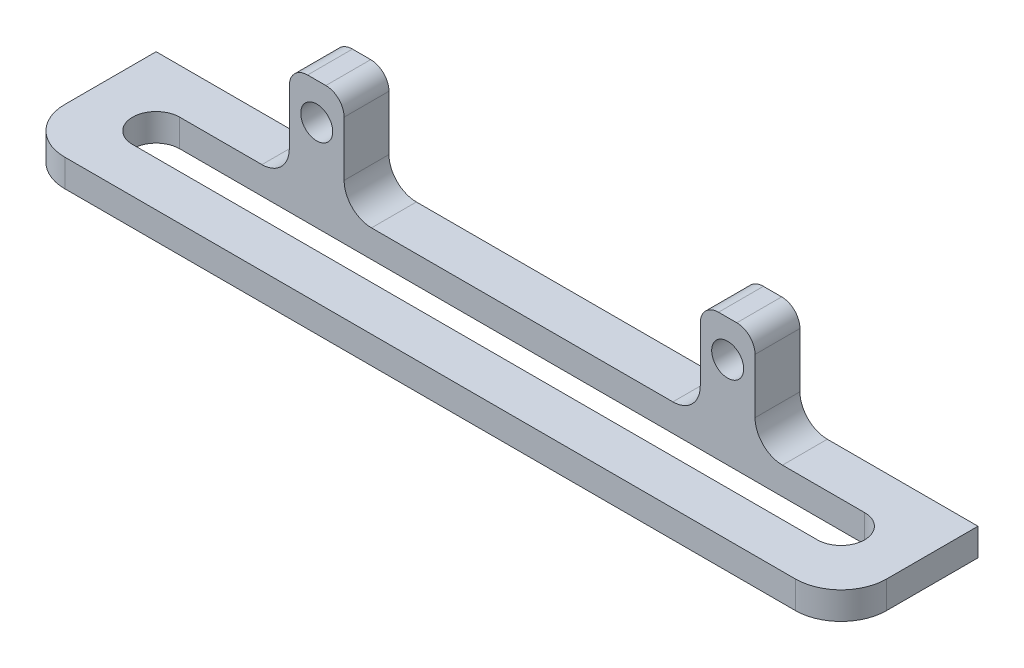
ISO-10303-21;
HEADER;
FILE_DESCRIPTION(('STEP AP214'),'2;1');
FILE_NAME('part.step','',(''),(''),'','','');
FILE_SCHEMA(('AUTOMOTIVE_DESIGN { 1 0 10303 214 1 1 1 1 }'));
ENDSEC;
DATA;
#1=APPLICATION_CONTEXT('core data for automotive mechanical design processes');
#2=APPLICATION_PROTOCOL_DEFINITION('international standard','automotive_design',2000,#1);
#3=PRODUCT_CONTEXT('',#1,'mechanical');
#4=PRODUCT('Part','Part','',(#3));
#5=PRODUCT_RELATED_PRODUCT_CATEGORY('part','',(#4));
#6=PRODUCT_DEFINITION_FORMATION('','',#4);
#7=PRODUCT_DEFINITION_CONTEXT('part definition',#1,'design');
#8=PRODUCT_DEFINITION('design','',#6,#7);
#9=PRODUCT_DEFINITION_SHAPE('','',#8);
#10=(LENGTH_UNIT() NAMED_UNIT(*) SI_UNIT(.MILLI.,.METRE.));
#11=(NAMED_UNIT(*) PLANE_ANGLE_UNIT() SI_UNIT($,.RADIAN.));
#12=(NAMED_UNIT(*) SI_UNIT($,.STERADIAN.) SOLID_ANGLE_UNIT());
#13=UNCERTAINTY_MEASURE_WITH_UNIT(LENGTH_MEASURE(1.E-05),#10,'distance_accuracy_value','');
#14=(GEOMETRIC_REPRESENTATION_CONTEXT(3) GLOBAL_UNCERTAINTY_ASSIGNED_CONTEXT((#13)) GLOBAL_UNIT_ASSIGNED_CONTEXT((#10,
#11,#12)) REPRESENTATION_CONTEXT('',''));
#15=CARTESIAN_POINT('',(0.,0.,0.));
#16=DIRECTION('',(0.,0.,1.));
#17=DIRECTION('',(1.,0.,0.));
#18=AXIS2_PLACEMENT_3D('',#15,#16,#17);
#19=CARTESIAN_POINT('',(0.,3.,0.));
#20=DIRECTION('',(0.,1.,0.));
#21=DIRECTION('',(0.,0.,1.));
#22=AXIS2_PLACEMENT_3D('',#19,#20,#21);
#23=PLANE('',#22);
#24=DIRECTION('',(-1.,0.,0.));
#25=VECTOR('',#24,1.);
#26=CARTESIAN_POINT('',(-37.5,3.,-2.58629015854807));
#27=LINE('',#26,#25);
#28=CARTESIAN_POINT('',(16.5,3.,-2.58629015854807));
#29=VERTEX_POINT('',#28);
#30=CARTESIAN_POINT('',(-16.5,3.,-2.58629015854807));
#31=VERTEX_POINT('',#30);
#32=EDGE_CURVE('E246',#29,#31,#27,.T.);
#33=ORIENTED_EDGE('',*,*,#32,.F.);
#34=DIRECTION('',(0.,0.,1.));
#35=VECTOR('',#34,1.);
#36=CARTESIAN_POINT('',(16.5,3.,0.));
#37=LINE('',#36,#35);
#38=CARTESIAN_POINT('',(16.5,3.,-7.5));
#39=VERTEX_POINT('',#38);
#40=EDGE_CURVE('E353',#29,#39,#37,.F.);
#41=ORIENTED_EDGE('',*,*,#40,.T.);
#42=DIRECTION('',(-1.,0.,0.));
#43=VECTOR('',#42,1.);
#44=CARTESIAN_POINT('',(-45.,3.,-7.5));
#45=LINE('',#44,#43);
#46=CARTESIAN_POINT('',(-16.5,3.,-7.5));
#47=VERTEX_POINT('',#46);
#48=EDGE_CURVE('E267',#39,#47,#45,.T.);
#49=ORIENTED_EDGE('',*,*,#48,.T.);
#50=DIRECTION('',(0.,0.,-1.));
#51=VECTOR('',#50,1.);
#52=CARTESIAN_POINT('',(-16.5,3.,0.));
#53=LINE('',#52,#51);
#54=EDGE_CURVE('E351',#47,#31,#53,.F.);
#55=ORIENTED_EDGE('',*,*,#54,.T.);
#56=EDGE_LOOP('',(#33,#41,#49,#55));
#57=FACE_BOUND('',#56,.T.);
#58=ADVANCED_FACE('F37',(#57),#23,.T.);
#59=CARTESIAN_POINT('',(45.,3.,-7.5));
#60=VERTEX_POINT('',#59);
#61=CARTESIAN_POINT('',(28.5,3.,-7.5));
#62=VERTEX_POINT('',#61);
#63=EDGE_CURVE('E264',#60,#62,#45,.T.);
#64=ORIENTED_EDGE('',*,*,#63,.T.);
#65=DIRECTION('',(0.,0.,-1.));
#66=VECTOR('',#65,1.);
#67=CARTESIAN_POINT('',(28.5,3.,0.));
#68=LINE('',#67,#66);
#69=CARTESIAN_POINT('',(28.5,3.,-2.58629015854807));
#70=VERTEX_POINT('',#69);
#71=EDGE_CURVE('E346',#62,#70,#68,.F.);
#72=ORIENTED_EDGE('',*,*,#71,.T.);
#73=CARTESIAN_POINT('',(37.5,3.,-2.58629015854807));
#74=VERTEX_POINT('',#73);
#75=EDGE_CURVE('E243',#74,#70,#27,.T.);
#76=ORIENTED_EDGE('',*,*,#75,.F.);
#77=CARTESIAN_POINT('',(37.5,3.,0.));
#78=DIRECTION('',(0.,1.,0.));
#79=DIRECTION('',(0.,0.,1.));
#80=AXIS2_PLACEMENT_3D('',#77,#78,#79);
#81=CIRCLE('',#80,2.58629015854807);
#82=CARTESIAN_POINT('',(37.5,3.,2.58629015854807));
#83=VERTEX_POINT('',#82);
#84=EDGE_CURVE('E237',#83,#74,#81,.T.);
#85=ORIENTED_EDGE('',*,*,#84,.F.);
#86=DIRECTION('',(1.,0.,0.));
#87=VECTOR('',#86,1.);
#88=CARTESIAN_POINT('',(-37.5,3.,2.58629015854807));
#89=LINE('',#88,#87);
#90=CARTESIAN_POINT('',(-37.5,3.,2.58629015854807));
#91=VERTEX_POINT('',#90);
#92=EDGE_CURVE('E221',#91,#83,#89,.T.);
#93=ORIENTED_EDGE('',*,*,#92,.F.);
#94=CARTESIAN_POINT('',(-37.5,3.,0.));
#95=DIRECTION('',(0.,1.,0.));
#96=DIRECTION('',(0.,0.,1.));
#97=AXIS2_PLACEMENT_3D('',#94,#95,#96);
#98=CIRCLE('',#97,2.58629015854807);
#99=CARTESIAN_POINT('',(-37.5,3.,-2.58629015854807));
#100=VERTEX_POINT('',#99);
#101=EDGE_CURVE('E211',#100,#91,#98,.T.);
#102=ORIENTED_EDGE('',*,*,#101,.F.);
#103=CARTESIAN_POINT('',(-28.5,3.,-2.58629015854807));
#104=VERTEX_POINT('',#103);
#105=EDGE_CURVE('E239',#104,#100,#27,.T.);
#106=ORIENTED_EDGE('',*,*,#105,.F.);
#107=DIRECTION('',(0.,0.,1.));
#108=VECTOR('',#107,1.);
#109=CARTESIAN_POINT('',(-28.5,3.,0.));
#110=LINE('',#109,#108);
#111=CARTESIAN_POINT('',(-28.5,3.,-7.5));
#112=VERTEX_POINT('',#111);
#113=EDGE_CURVE('E344',#104,#112,#110,.F.);
#114=ORIENTED_EDGE('',*,*,#113,.T.);
#115=CARTESIAN_POINT('',(-45.,3.,-7.5));
#116=VERTEX_POINT('',#115);
#117=EDGE_CURVE('E262',#112,#116,#45,.T.);
#118=ORIENTED_EDGE('',*,*,#117,.T.);
#119=DIRECTION('',(0.,0.,1.));
#120=VECTOR('',#119,1.);
#121=CARTESIAN_POINT('',(-45.,3.,-7.5));
#122=LINE('',#121,#120);
#123=CARTESIAN_POINT('',(-45.,3.,2.5));
#124=VERTEX_POINT('',#123);
#125=EDGE_CURVE('E266',#116,#124,#122,.T.);
#126=ORIENTED_EDGE('',*,*,#125,.T.);
#127=CARTESIAN_POINT('',(-40.,3.,2.5));
#128=DIRECTION('',(0.,1.,0.));
#129=DIRECTION('',(0.,0.,1.));
#130=AXIS2_PLACEMENT_3D('',#127,#128,#129);
#131=CIRCLE('',#130,5.);
#132=CARTESIAN_POINT('',(-40.,3.,7.5));
#133=VERTEX_POINT('',#132);
#134=EDGE_CURVE('E299',#124,#133,#131,.T.);
#135=ORIENTED_EDGE('',*,*,#134,.T.);
#136=DIRECTION('',(1.,0.,0.));
#137=VECTOR('',#136,1.);
#138=CARTESIAN_POINT('',(-45.,3.,7.5));
#139=LINE('',#138,#137);
#140=CARTESIAN_POINT('',(40.,3.,7.5));
#141=VERTEX_POINT('',#140);
#142=EDGE_CURVE('E270',#133,#141,#139,.T.);
#143=ORIENTED_EDGE('',*,*,#142,.T.);
#144=CARTESIAN_POINT('',(40.,3.,2.5));
#145=DIRECTION('',(0.,1.,0.));
#146=DIRECTION('',(0.,0.,1.));
#147=AXIS2_PLACEMENT_3D('',#144,#145,#146);
#148=CIRCLE('',#147,5.);
#149=CARTESIAN_POINT('',(45.,3.,2.5));
#150=VERTEX_POINT('',#149);
#151=EDGE_CURVE('E301',#141,#150,#148,.T.);
#152=ORIENTED_EDGE('',*,*,#151,.T.);
#153=DIRECTION('',(0.,0.,-1.));
#154=VECTOR('',#153,1.);
#155=CARTESIAN_POINT('',(45.,3.,-7.5));
#156=LINE('',#155,#154);
#157=EDGE_CURVE('E260',#150,#60,#156,.T.);
#158=ORIENTED_EDGE('',*,*,#157,.T.);
#159=EDGE_LOOP('',(#64,#72,#76,#85,#93,#102,#106,#114,#118,#126,#135,#143,#152,#158));
#160=FACE_BOUND('',#159,.T.);
#161=ADVANCED_FACE('F234',(#160),#23,.T.);
#162=CARTESIAN_POINT('',(0.,0.,0.));
#163=DIRECTION('',(0.,1.,0.));
#164=DIRECTION('',(0.,0.,1.));
#165=AXIS2_PLACEMENT_3D('',#162,#163,#164);
#166=PLANE('',#165);
#167=DIRECTION('',(0.,0.,-1.));
#168=VECTOR('',#167,1.);
#169=CARTESIAN_POINT('',(45.,0.,-7.5));
#170=LINE('',#169,#168);
#171=CARTESIAN_POINT('',(45.,0.,2.5));
#172=VERTEX_POINT('',#171);
#173=CARTESIAN_POINT('',(45.,0.,-7.5));
#174=VERTEX_POINT('',#173);
#175=EDGE_CURVE('E229',#172,#174,#170,.T.);
#176=ORIENTED_EDGE('',*,*,#175,.F.);
#177=CARTESIAN_POINT('',(40.,0.,2.5));
#178=DIRECTION('',(0.,1.,0.));
#179=DIRECTION('',(0.,0.,1.));
#180=AXIS2_PLACEMENT_3D('',#177,#178,#179);
#181=CIRCLE('',#180,5.);
#182=CARTESIAN_POINT('',(40.,0.,7.5));
#183=VERTEX_POINT('',#182);
#184=EDGE_CURVE('E292',#172,#183,#181,.F.);
#185=ORIENTED_EDGE('',*,*,#184,.T.);
#186=DIRECTION('',(1.,0.,0.));
#187=VECTOR('',#186,1.);
#188=CARTESIAN_POINT('',(-45.,0.,7.5));
#189=LINE('',#188,#187);
#190=CARTESIAN_POINT('',(-40.,0.,7.5));
#191=VERTEX_POINT('',#190);
#192=EDGE_CURVE('E263',#191,#183,#189,.T.);
#193=ORIENTED_EDGE('',*,*,#192,.F.);
#194=CARTESIAN_POINT('',(-40.,0.,2.5));
#195=DIRECTION('',(0.,1.,0.));
#196=DIRECTION('',(0.,0.,1.));
#197=AXIS2_PLACEMENT_3D('',#194,#195,#196);
#198=CIRCLE('',#197,5.);
#199=CARTESIAN_POINT('',(-45.,0.,2.5));
#200=VERTEX_POINT('',#199);
#201=EDGE_CURVE('E290',#191,#200,#198,.F.);
#202=ORIENTED_EDGE('',*,*,#201,.T.);
#203=DIRECTION('',(0.,0.,1.));
#204=VECTOR('',#203,1.);
#205=CARTESIAN_POINT('',(-45.,0.,-7.5));
#206=LINE('',#205,#204);
#207=CARTESIAN_POINT('',(-45.,0.,-7.5));
#208=VERTEX_POINT('',#207);
#209=EDGE_CURVE('E277',#208,#200,#206,.T.);
#210=ORIENTED_EDGE('',*,*,#209,.F.);
#211=DIRECTION('',(-1.,0.,0.));
#212=VECTOR('',#211,1.);
#213=CARTESIAN_POINT('',(-45.,0.,-7.5));
#214=LINE('',#213,#212);
#215=EDGE_CURVE('E275',#174,#208,#214,.T.);
#216=ORIENTED_EDGE('',*,*,#215,.F.);
#217=EDGE_LOOP('',(#176,#185,#193,#202,#210,#216));
#218=FACE_BOUND('',#217,.T.);
#219=CARTESIAN_POINT('',(-37.5,0.,0.));
#220=DIRECTION('',(0.,1.,0.));
#221=DIRECTION('',(0.,0.,1.));
#222=AXIS2_PLACEMENT_3D('',#219,#220,#221);
#223=CIRCLE('',#222,2.58629015854807);
#224=CARTESIAN_POINT('',(-37.5,0.,-2.58629015854807));
#225=VERTEX_POINT('',#224);
#226=CARTESIAN_POINT('',(-37.5,0.,2.58629015854807));
#227=VERTEX_POINT('',#226);
#228=EDGE_CURVE('E247',#225,#227,#223,.T.);
#229=ORIENTED_EDGE('',*,*,#228,.T.);
#230=DIRECTION('',(1.,0.,0.));
#231=VECTOR('',#230,1.);
#232=CARTESIAN_POINT('',(-37.5,0.,2.58629015854807));
#233=LINE('',#232,#231);
#234=CARTESIAN_POINT('',(37.5,0.,2.58629015854807));
#235=VERTEX_POINT('',#234);
#236=EDGE_CURVE('E228',#227,#235,#233,.T.);
#237=ORIENTED_EDGE('',*,*,#236,.T.);
#238=CARTESIAN_POINT('',(37.5,0.,0.));
#239=DIRECTION('',(0.,1.,0.));
#240=DIRECTION('',(0.,0.,1.));
#241=AXIS2_PLACEMENT_3D('',#238,#239,#240);
#242=CIRCLE('',#241,2.58629015854807);
#243=CARTESIAN_POINT('',(37.5,0.,-2.58629015854807));
#244=VERTEX_POINT('',#243);
#245=EDGE_CURVE('E251',#235,#244,#242,.T.);
#246=ORIENTED_EDGE('',*,*,#245,.T.);
#247=DIRECTION('',(-1.,0.,0.));
#248=VECTOR('',#247,1.);
#249=CARTESIAN_POINT('',(-37.5,0.,-2.58629015854807));
#250=LINE('',#249,#248);
#251=EDGE_CURVE('E222',#244,#225,#250,.T.);
#252=ORIENTED_EDGE('',*,*,#251,.T.);
#253=EDGE_LOOP('',(#229,#237,#246,#252));
#254=FACE_BOUND('',#253,.T.);
#255=ADVANCED_FACE('F495',(#218,#254),#166,.F.);
#256=CARTESIAN_POINT('',(45.,3.,-7.5));
#257=DIRECTION('',(-1.,0.,0.));
#258=DIRECTION('',(0.,0.,1.));
#259=AXIS2_PLACEMENT_3D('',#256,#257,#258);
#260=PLANE('',#259);
#261=ORIENTED_EDGE('',*,*,#157,.F.);
#262=DIRECTION('',(0.,-1.,0.));
#263=VECTOR('',#262,1.);
#264=CARTESIAN_POINT('',(45.,3.,2.5));
#265=LINE('',#264,#263);
#266=EDGE_CURVE('E287',#150,#172,#265,.T.);
#267=ORIENTED_EDGE('',*,*,#266,.T.);
#268=ORIENTED_EDGE('',*,*,#175,.T.);
#269=DIRECTION('',(0.,-1.,0.));
#270=VECTOR('',#269,1.);
#271=CARTESIAN_POINT('',(45.,3.,-7.5));
#272=LINE('',#271,#270);
#273=EDGE_CURVE('E284',#60,#174,#272,.T.);
#274=ORIENTED_EDGE('',*,*,#273,.F.);
#275=EDGE_LOOP('',(#261,#267,#268,#274));
#276=FACE_BOUND('',#275,.T.);
#277=ADVANCED_FACE('F437',(#276),#260,.F.);
#278=CARTESIAN_POINT('',(-45.,3.,-7.5));
#279=DIRECTION('',(0.,0.,1.));
#280=DIRECTION('',(1.,0.,0.));
#281=AXIS2_PLACEMENT_3D('',#278,#279,#280);
#282=PLANE('',#281);
#283=CARTESIAN_POINT('',(22.5,10.,-7.5));
#284=DIRECTION('',(0.,0.,1.));
#285=DIRECTION('',(1.,0.,0.));
#286=AXIS2_PLACEMENT_3D('',#283,#284,#285);
#287=CIRCLE('',#286,1.75);
#288=CARTESIAN_POINT('',(24.25,10.,-7.5));
#289=VERTEX_POINT('',#288);
#290=EDGE_CURVE('E817',#289,#289,#287,.T.);
#291=ORIENTED_EDGE('',*,*,#290,.T.);
#292=EDGE_LOOP('',(#291));
#293=FACE_BOUND('',#292,.T.);
#294=CARTESIAN_POINT('',(-22.5,10.,-7.5));
#295=DIRECTION('',(0.,0.,1.));
#296=DIRECTION('',(1.,0.,0.));
#297=AXIS2_PLACEMENT_3D('',#294,#295,#296);
#298=CIRCLE('',#297,1.75);
#299=CARTESIAN_POINT('',(-20.75,10.,-7.5));
#300=VERTEX_POINT('',#299);
#301=EDGE_CURVE('E458',#300,#300,#298,.F.);
#302=ORIENTED_EDGE('',*,*,#301,.F.);
#303=EDGE_LOOP('',(#302));
#304=FACE_BOUND('',#303,.T.);
#305=DIRECTION('',(-1.,0.,0.));
#306=VECTOR('',#305,1.);
#307=CARTESIAN_POINT('',(19.5,14.,-7.50000000000001));
#308=LINE('',#307,#306);
#309=CARTESIAN_POINT('',(23.5,14.,-7.50000000000001));
#310=VERTEX_POINT('',#309);
#311=CARTESIAN_POINT('',(21.5,14.,-7.50000000000001));
#312=VERTEX_POINT('',#311);
#313=EDGE_CURVE('E464',#310,#312,#308,.T.);
#314=ORIENTED_EDGE('',*,*,#313,.F.);
#315=CARTESIAN_POINT('',(23.5,12.,-7.5));
#316=DIRECTION('',(0.,0.,1.));
#317=DIRECTION('',(1.,0.,0.));
#318=AXIS2_PLACEMENT_3D('',#315,#316,#317);
#319=CIRCLE('',#318,2.);
#320=CARTESIAN_POINT('',(25.5,12.,-7.50000000000001));
#321=VERTEX_POINT('',#320);
#322=EDGE_CURVE('E317',#310,#321,#319,.F.);
#323=ORIENTED_EDGE('',*,*,#322,.T.);
#324=DIRECTION('',(0.,-1.,0.));
#325=VECTOR('',#324,1.);
#326=CARTESIAN_POINT('',(25.5,14.,-7.50000000000001));
#327=LINE('',#326,#325);
#328=CARTESIAN_POINT('',(25.5,6.,-7.50000000000001));
#329=VERTEX_POINT('',#328);
#330=EDGE_CURVE('E452',#321,#329,#327,.T.);
#331=ORIENTED_EDGE('',*,*,#330,.T.);
#332=CARTESIAN_POINT('',(28.5,6.,-7.5));
#333=DIRECTION('',(0.,0.,1.));
#334=DIRECTION('',(1.,0.,0.));
#335=AXIS2_PLACEMENT_3D('',#332,#333,#334);
#336=CIRCLE('',#335,3.);
#337=EDGE_CURVE('E360',#329,#62,#336,.T.);
#338=ORIENTED_EDGE('',*,*,#337,.T.);
#339=ORIENTED_EDGE('',*,*,#63,.F.);
#340=ORIENTED_EDGE('',*,*,#273,.T.);
#341=ORIENTED_EDGE('',*,*,#215,.T.);
#342=DIRECTION('',(0.,-1.,0.));
#343=VECTOR('',#342,1.);
#344=CARTESIAN_POINT('',(-45.,3.,-7.5));
#345=LINE('',#344,#343);
#346=EDGE_CURVE('E273',#116,#208,#345,.T.);
#347=ORIENTED_EDGE('',*,*,#346,.F.);
#348=ORIENTED_EDGE('',*,*,#117,.F.);
#349=CARTESIAN_POINT('',(-28.5,6.,-7.5));
#350=DIRECTION('',(0.,0.,1.));
#351=DIRECTION('',(1.,0.,0.));
#352=AXIS2_PLACEMENT_3D('',#349,#350,#351);
#353=CIRCLE('',#352,3.);
#354=CARTESIAN_POINT('',(-25.5,6.,-7.5));
#355=VERTEX_POINT('',#354);
#356=EDGE_CURVE('E11',#112,#355,#353,.T.);
#357=ORIENTED_EDGE('',*,*,#356,.T.);
#358=DIRECTION('',(0.,-1.,0.));
#359=VECTOR('',#358,1.);
#360=CARTESIAN_POINT('',(-25.5,14.,-7.5));
#361=LINE('',#360,#359);
#362=CARTESIAN_POINT('',(-25.5,12.,-7.5));
#363=VERTEX_POINT('',#362);
#364=EDGE_CURVE('E379',#363,#355,#361,.T.);
#365=ORIENTED_EDGE('',*,*,#364,.F.);
#366=CARTESIAN_POINT('',(-23.5,12.,-7.5));
#367=DIRECTION('',(0.,0.,1.));
#368=DIRECTION('',(1.,0.,0.));
#369=AXIS2_PLACEMENT_3D('',#366,#367,#368);
#370=CIRCLE('',#369,2.);
#371=CARTESIAN_POINT('',(-23.5,14.,-7.5));
#372=VERTEX_POINT('',#371);
#373=EDGE_CURVE('E311',#363,#372,#370,.F.);
#374=ORIENTED_EDGE('',*,*,#373,.T.);
#375=DIRECTION('',(-1.,0.,0.));
#376=VECTOR('',#375,1.);
#377=CARTESIAN_POINT('',(-25.5,14.,-7.5));
#378=LINE('',#377,#376);
#379=CARTESIAN_POINT('',(-21.5,14.,-7.5));
#380=VERTEX_POINT('',#379);
#381=EDGE_CURVE('E382',#380,#372,#378,.T.);
#382=ORIENTED_EDGE('',*,*,#381,.F.);
#383=CARTESIAN_POINT('',(-21.5,12.,-7.5));
#384=DIRECTION('',(0.,0.,1.));
#385=DIRECTION('',(1.,0.,0.));
#386=AXIS2_PLACEMENT_3D('',#383,#384,#385);
#387=CIRCLE('',#386,2.);
#388=CARTESIAN_POINT('',(-19.5,12.,-7.5));
#389=VERTEX_POINT('',#388);
#390=EDGE_CURVE('E313',#380,#389,#387,.F.);
#391=ORIENTED_EDGE('',*,*,#390,.T.);
#392=DIRECTION('',(0.,-1.,0.));
#393=VECTOR('',#392,1.);
#394=CARTESIAN_POINT('',(-19.5,14.,-7.5));
#395=LINE('',#394,#393);
#396=CARTESIAN_POINT('',(-19.5,6.,-7.5));
#397=VERTEX_POINT('',#396);
#398=EDGE_CURVE('E381',#389,#397,#395,.T.);
#399=ORIENTED_EDGE('',*,*,#398,.T.);
#400=CARTESIAN_POINT('',(-16.5,6.,-7.5));
#401=DIRECTION('',(0.,0.,1.));
#402=DIRECTION('',(1.,0.,0.));
#403=AXIS2_PLACEMENT_3D('',#400,#401,#402);
#404=CIRCLE('',#403,3.);
#405=EDGE_CURVE('E368',#397,#47,#404,.T.);
#406=ORIENTED_EDGE('',*,*,#405,.T.);
#407=ORIENTED_EDGE('',*,*,#48,.F.);
#408=CARTESIAN_POINT('',(16.5,6.,-7.5));
#409=DIRECTION('',(0.,0.,1.));
#410=DIRECTION('',(1.,0.,0.));
#411=AXIS2_PLACEMENT_3D('',#408,#409,#410);
#412=CIRCLE('',#411,3.);
#413=CARTESIAN_POINT('',(19.5,6.,-7.50000000000001));
#414=VERTEX_POINT('',#413);
#415=EDGE_CURVE('E366',#39,#414,#412,.T.);
#416=ORIENTED_EDGE('',*,*,#415,.T.);
#417=DIRECTION('',(0.,-1.,0.));
#418=VECTOR('',#417,1.);
#419=CARTESIAN_POINT('',(19.5,14.,-7.50000000000001));
#420=LINE('',#419,#418);
#421=CARTESIAN_POINT('',(19.5,12.,-7.50000000000001));
#422=VERTEX_POINT('',#421);
#423=EDGE_CURVE('E455',#422,#414,#420,.T.);
#424=ORIENTED_EDGE('',*,*,#423,.F.);
#425=CARTESIAN_POINT('',(21.5,12.,-7.5));
#426=DIRECTION('',(0.,0.,1.));
#427=DIRECTION('',(1.,0.,0.));
#428=AXIS2_PLACEMENT_3D('',#425,#426,#427);
#429=CIRCLE('',#428,2.);
#430=EDGE_CURVE('E315',#422,#312,#429,.F.);
#431=ORIENTED_EDGE('',*,*,#430,.T.);
#432=EDGE_LOOP('',(#314,#323,#331,#338,#339,#340,#341,#347,#348,#357,#365,#374,#382,#391,#399,
#406,#407,#416,#424,#431));
#433=FACE_BOUND('',#432,.T.);
#434=ADVANCED_FACE('F407',(#293,#304,#433),#282,.F.);
#435=CARTESIAN_POINT('',(-45.,3.,-7.5));
#436=DIRECTION('',(1.,0.,0.));
#437=DIRECTION('',(0.,0.,-1.));
#438=AXIS2_PLACEMENT_3D('',#435,#436,#437);
#439=PLANE('',#438);
#440=ORIENTED_EDGE('',*,*,#209,.T.);
#441=DIRECTION('',(0.,-1.,0.));
#442=VECTOR('',#441,1.);
#443=CARTESIAN_POINT('',(-45.,3.,2.5));
#444=LINE('',#443,#442);
#445=EDGE_CURVE('E303',#200,#124,#444,.F.);
#446=ORIENTED_EDGE('',*,*,#445,.T.);
#447=ORIENTED_EDGE('',*,*,#125,.F.);
#448=ORIENTED_EDGE('',*,*,#346,.T.);
#449=EDGE_LOOP('',(#440,#446,#447,#448));
#450=FACE_BOUND('',#449,.T.);
#451=ADVANCED_FACE('F419',(#450),#439,.F.);
#452=CARTESIAN_POINT('',(-45.,3.,7.5));
#453=DIRECTION('',(0.,0.,-1.));
#454=DIRECTION('',(-1.,0.,0.));
#455=AXIS2_PLACEMENT_3D('',#452,#453,#454);
#456=PLANE('',#455);
#457=ORIENTED_EDGE('',*,*,#192,.T.);
#458=DIRECTION('',(0.,-1.,0.));
#459=VECTOR('',#458,1.);
#460=CARTESIAN_POINT('',(40.,3.,7.5));
#461=LINE('',#460,#459);
#462=EDGE_CURVE('E297',#183,#141,#461,.F.);
#463=ORIENTED_EDGE('',*,*,#462,.T.);
#464=ORIENTED_EDGE('',*,*,#142,.F.);
#465=DIRECTION('',(0.,-1.,0.));
#466=VECTOR('',#465,1.);
#467=CARTESIAN_POINT('',(-40.,3.,7.5));
#468=LINE('',#467,#466);
#469=EDGE_CURVE('E294',#133,#191,#468,.T.);
#470=ORIENTED_EDGE('',*,*,#469,.T.);
#471=EDGE_LOOP('',(#457,#463,#464,#470));
#472=FACE_BOUND('',#471,.T.);
#473=ADVANCED_FACE('F427',(#472),#456,.F.);
#474=CARTESIAN_POINT('',(-37.5,3.,0.));
#475=DIRECTION('',(0.,-1.,0.));
#476=DIRECTION('',(0.,0.,-1.));
#477=AXIS2_PLACEMENT_3D('',#474,#475,#476);
#478=CYLINDRICAL_SURFACE('',#477,2.58629015854807);
#479=ORIENTED_EDGE('',*,*,#228,.F.);
#480=DIRECTION('',(0.,-1.,0.));
#481=VECTOR('',#480,1.);
#482=CARTESIAN_POINT('',(-37.5,3.,-2.58629015854807));
#483=LINE('',#482,#481);
#484=EDGE_CURVE('E217',#100,#225,#483,.T.);
#485=ORIENTED_EDGE('',*,*,#484,.F.);
#486=ORIENTED_EDGE('',*,*,#101,.T.);
#487=DIRECTION('',(0.,-1.,0.));
#488=VECTOR('',#487,1.);
#489=CARTESIAN_POINT('',(-37.5,3.,2.58629015854807));
#490=LINE('',#489,#488);
#491=EDGE_CURVE('E214',#91,#227,#490,.T.);
#492=ORIENTED_EDGE('',*,*,#491,.T.);
#493=EDGE_LOOP('',(#479,#485,#486,#492));
#494=FACE_BOUND('',#493,.T.);
#495=ADVANCED_FACE('F213',(#494),#478,.F.);
#496=CARTESIAN_POINT('',(-37.5,3.,2.58629015854807));
#497=DIRECTION('',(0.,0.,-1.));
#498=DIRECTION('',(-1.,0.,0.));
#499=AXIS2_PLACEMENT_3D('',#496,#497,#498);
#500=PLANE('',#499);
#501=ORIENTED_EDGE('',*,*,#236,.F.);
#502=ORIENTED_EDGE('',*,*,#491,.F.);
#503=ORIENTED_EDGE('',*,*,#92,.T.);
#504=DIRECTION('',(0.,-1.,0.));
#505=VECTOR('',#504,1.);
#506=CARTESIAN_POINT('',(37.5,3.,2.58629015854807));
#507=LINE('',#506,#505);
#508=EDGE_CURVE('E230',#83,#235,#507,.T.);
#509=ORIENTED_EDGE('',*,*,#508,.T.);
#510=EDGE_LOOP('',(#501,#502,#503,#509));
#511=FACE_BOUND('',#510,.T.);
#512=ADVANCED_FACE('F225',(#511),#500,.T.);
#513=CARTESIAN_POINT('',(37.5,3.,0.));
#514=DIRECTION('',(0.,-1.,0.));
#515=DIRECTION('',(0.,0.,-1.));
#516=AXIS2_PLACEMENT_3D('',#513,#514,#515);
#517=CYLINDRICAL_SURFACE('',#516,2.58629015854807);
#518=ORIENTED_EDGE('',*,*,#245,.F.);
#519=ORIENTED_EDGE('',*,*,#508,.F.);
#520=ORIENTED_EDGE('',*,*,#84,.T.);
#521=DIRECTION('',(0.,-1.,0.));
#522=VECTOR('',#521,1.);
#523=CARTESIAN_POINT('',(37.5,3.,-2.58629015854807));
#524=LINE('',#523,#522);
#525=EDGE_CURVE('E257',#74,#244,#524,.T.);
#526=ORIENTED_EDGE('',*,*,#525,.T.);
#527=EDGE_LOOP('',(#518,#519,#520,#526));
#528=FACE_BOUND('',#527,.T.);
#529=ADVANCED_FACE('F615',(#528),#517,.F.);
#530=CARTESIAN_POINT('',(-37.5,3.,-2.58629015854807));
#531=DIRECTION('',(0.,0.,1.));
#532=DIRECTION('',(1.,0.,0.));
#533=AXIS2_PLACEMENT_3D('',#530,#531,#532);
#534=PLANE('',#533);
#535=CARTESIAN_POINT('',(22.5,10.,-2.58629015854807));
#536=DIRECTION('',(0.,0.,-1.));
#537=DIRECTION('',(-1.,0.,0.));
#538=AXIS2_PLACEMENT_3D('',#535,#536,#537);
#539=CIRCLE('',#538,1.75);
#540=CARTESIAN_POINT('',(20.75,10.,-2.58629015854807));
#541=VERTEX_POINT('',#540);
#542=EDGE_CURVE('E820',#541,#541,#539,.T.);
#543=ORIENTED_EDGE('',*,*,#542,.T.);
#544=EDGE_LOOP('',(#543));
#545=FACE_BOUND('',#544,.T.);
#546=CARTESIAN_POINT('',(-22.5,10.,-2.58629015854807));
#547=DIRECTION('',(0.,0.,1.));
#548=DIRECTION('',(1.,0.,0.));
#549=AXIS2_PLACEMENT_3D('',#546,#547,#548);
#550=CIRCLE('',#549,1.75);
#551=CARTESIAN_POINT('',(-20.75,10.,-2.58629015854807));
#552=VERTEX_POINT('',#551);
#553=EDGE_CURVE('E815',#552,#552,#550,.T.);
#554=ORIENTED_EDGE('',*,*,#553,.F.);
#555=EDGE_LOOP('',(#554));
#556=FACE_BOUND('',#555,.T.);
#557=DIRECTION('',(0.,-1.,0.));
#558=VECTOR('',#557,1.);
#559=CARTESIAN_POINT('',(25.5,14.,-2.58629015854807));
#560=LINE('',#559,#558);
#561=CARTESIAN_POINT('',(25.5,12.,-2.58629015854807));
#562=VERTEX_POINT('',#561);
#563=CARTESIAN_POINT('',(25.5,6.,-2.58629015854807));
#564=VERTEX_POINT('',#563);
#565=EDGE_CURVE('E446',#562,#564,#560,.T.);
#566=ORIENTED_EDGE('',*,*,#565,.F.);
#567=CARTESIAN_POINT('',(23.5,12.,-2.58629015854807));
#568=DIRECTION('',(0.,0.,1.));
#569=DIRECTION('',(1.,0.,0.));
#570=AXIS2_PLACEMENT_3D('',#567,#568,#569);
#571=CIRCLE('',#570,2.);
#572=CARTESIAN_POINT('',(23.5,14.,-2.58629015854807));
#573=VERTEX_POINT('',#572);
#574=EDGE_CURVE('E327',#562,#573,#571,.T.);
#575=ORIENTED_EDGE('',*,*,#574,.T.);
#576=DIRECTION('',(1.,0.,0.));
#577=VECTOR('',#576,1.);
#578=CARTESIAN_POINT('',(19.5,14.,-2.58629015854807));
#579=LINE('',#578,#577);
#580=CARTESIAN_POINT('',(21.5,14.,-2.58629015854807));
#581=VERTEX_POINT('',#580);
#582=EDGE_CURVE('E467',#581,#573,#579,.T.);
#583=ORIENTED_EDGE('',*,*,#582,.F.);
#584=CARTESIAN_POINT('',(21.5,12.,-2.58629015854807));
#585=DIRECTION('',(0.,0.,1.));
#586=DIRECTION('',(1.,0.,0.));
#587=AXIS2_PLACEMENT_3D('',#584,#585,#586);
#588=CIRCLE('',#587,2.);
#589=CARTESIAN_POINT('',(19.5,12.,-2.58629015854807));
#590=VERTEX_POINT('',#589);
#591=EDGE_CURVE('E325',#581,#590,#588,.T.);
#592=ORIENTED_EDGE('',*,*,#591,.T.);
#593=DIRECTION('',(0.,-1.,0.));
#594=VECTOR('',#593,1.);
#595=CARTESIAN_POINT('',(19.5,14.,-2.58629015854807));
#596=LINE('',#595,#594);
#597=CARTESIAN_POINT('',(19.5,6.,-2.58629015854807));
#598=VERTEX_POINT('',#597);
#599=EDGE_CURVE('E453',#590,#598,#596,.T.);
#600=ORIENTED_EDGE('',*,*,#599,.T.);
#601=CARTESIAN_POINT('',(16.5,6.,-2.58629015854807));
#602=DIRECTION('',(0.,0.,1.));
#603=DIRECTION('',(1.,0.,0.));
#604=AXIS2_PLACEMENT_3D('',#601,#602,#603);
#605=CIRCLE('',#604,3.);
#606=EDGE_CURVE('E364',#598,#29,#605,.F.);
#607=ORIENTED_EDGE('',*,*,#606,.T.);
#608=ORIENTED_EDGE('',*,*,#32,.T.);
#609=CARTESIAN_POINT('',(-16.5,6.,-2.58629015854807));
#610=DIRECTION('',(0.,0.,1.));
#611=DIRECTION('',(1.,0.,0.));
#612=AXIS2_PLACEMENT_3D('',#609,#610,#611);
#613=CIRCLE('',#612,3.);
#614=CARTESIAN_POINT('',(-19.5,6.,-2.58629015854807));
#615=VERTEX_POINT('',#614);
#616=EDGE_CURVE('E370',#31,#615,#613,.F.);
#617=ORIENTED_EDGE('',*,*,#616,.T.);
#618=DIRECTION('',(0.,-1.,0.));
#619=VECTOR('',#618,1.);
#620=CARTESIAN_POINT('',(-19.5,14.,-2.58629015854807));
#621=LINE('',#620,#619);
#622=CARTESIAN_POINT('',(-19.5,12.,-2.58629015854807));
#623=VERTEX_POINT('',#622);
#624=EDGE_CURVE('E385',#623,#615,#621,.T.);
#625=ORIENTED_EDGE('',*,*,#624,.F.);
#626=CARTESIAN_POINT('',(-21.5,12.,-2.58629015854807));
#627=DIRECTION('',(0.,0.,1.));
#628=DIRECTION('',(1.,0.,0.));
#629=AXIS2_PLACEMENT_3D('',#626,#627,#628);
#630=CIRCLE('',#629,2.);
#631=CARTESIAN_POINT('',(-21.5,14.,-2.58629015854807));
#632=VERTEX_POINT('',#631);
#633=EDGE_CURVE('E323',#623,#632,#630,.T.);
#634=ORIENTED_EDGE('',*,*,#633,.T.);
#635=DIRECTION('',(1.,0.,0.));
#636=VECTOR('',#635,1.);
#637=CARTESIAN_POINT('',(-25.5,14.,-2.58629015854807));
#638=LINE('',#637,#636);
#639=CARTESIAN_POINT('',(-23.5,14.,-2.58629015854807));
#640=VERTEX_POINT('',#639);
#641=EDGE_CURVE('E388',#640,#632,#638,.T.);
#642=ORIENTED_EDGE('',*,*,#641,.F.);
#643=CARTESIAN_POINT('',(-23.5,12.,-2.58629015854807));
#644=DIRECTION('',(0.,0.,1.));
#645=DIRECTION('',(1.,0.,0.));
#646=AXIS2_PLACEMENT_3D('',#643,#644,#645);
#647=CIRCLE('',#646,2.);
#648=CARTESIAN_POINT('',(-25.5,12.,-2.58629015854807));
#649=VERTEX_POINT('',#648);
#650=EDGE_CURVE('E321',#640,#649,#647,.T.);
#651=ORIENTED_EDGE('',*,*,#650,.T.);
#652=DIRECTION('',(0.,-1.,0.));
#653=VECTOR('',#652,1.);
#654=CARTESIAN_POINT('',(-25.5,14.,-2.58629015854807));
#655=LINE('',#654,#653);
#656=CARTESIAN_POINT('',(-25.5,6.,-2.58629015854807));
#657=VERTEX_POINT('',#656);
#658=EDGE_CURVE('E249',#649,#657,#655,.T.);
#659=ORIENTED_EDGE('',*,*,#658,.T.);
#660=CARTESIAN_POINT('',(-28.5,6.,-2.58629015854807));
#661=DIRECTION('',(0.,0.,1.));
#662=DIRECTION('',(1.,0.,0.));
#663=AXIS2_PLACEMENT_3D('',#660,#661,#662);
#664=CIRCLE('',#663,3.);
#665=EDGE_CURVE('E45',#657,#104,#664,.F.);
#666=ORIENTED_EDGE('',*,*,#665,.T.);
#667=ORIENTED_EDGE('',*,*,#105,.T.);
#668=ORIENTED_EDGE('',*,*,#484,.T.);
#669=ORIENTED_EDGE('',*,*,#251,.F.);
#670=ORIENTED_EDGE('',*,*,#525,.F.);
#671=ORIENTED_EDGE('',*,*,#75,.T.);
#672=CARTESIAN_POINT('',(28.5,6.,-2.58629015854807));
#673=DIRECTION('',(0.,0.,1.));
#674=DIRECTION('',(1.,0.,0.));
#675=AXIS2_PLACEMENT_3D('',#672,#673,#674);
#676=CIRCLE('',#675,3.);
#677=EDGE_CURVE('E362',#70,#564,#676,.F.);
#678=ORIENTED_EDGE('',*,*,#677,.T.);
#679=EDGE_LOOP('',(#566,#575,#583,#592,#600,#607,#608,#617,#625,#634,#642,#651,#659,#666,#667,
#668,#669,#670,#671,#678));
#680=FACE_BOUND('',#679,.T.);
#681=ADVANCED_FACE('F374',(#545,#556,#680),#534,.T.);
#682=CARTESIAN_POINT('',(40.,3.,2.5));
#683=DIRECTION('',(0.,-1.,0.));
#684=DIRECTION('',(0.,0.,-1.));
#685=AXIS2_PLACEMENT_3D('',#682,#683,#684);
#686=CYLINDRICAL_SURFACE('',#685,5.);
#687=ORIENTED_EDGE('',*,*,#151,.F.);
#688=ORIENTED_EDGE('',*,*,#462,.F.);
#689=ORIENTED_EDGE('',*,*,#184,.F.);
#690=ORIENTED_EDGE('',*,*,#266,.F.);
#691=EDGE_LOOP('',(#687,#688,#689,#690));
#692=FACE_BOUND('',#691,.T.);
#693=ADVANCED_FACE('F431',(#692),#686,.T.);
#694=CARTESIAN_POINT('',(-40.,3.,2.5));
#695=DIRECTION('',(0.,-1.,0.));
#696=DIRECTION('',(0.,0.,-1.));
#697=AXIS2_PLACEMENT_3D('',#694,#695,#696);
#698=CYLINDRICAL_SURFACE('',#697,5.);
#699=ORIENTED_EDGE('',*,*,#134,.F.);
#700=ORIENTED_EDGE('',*,*,#445,.F.);
#701=ORIENTED_EDGE('',*,*,#201,.F.);
#702=ORIENTED_EDGE('',*,*,#469,.F.);
#703=EDGE_LOOP('',(#699,#700,#701,#702));
#704=FACE_BOUND('',#703,.T.);
#705=ADVANCED_FACE('F422',(#704),#698,.T.);
#706=CARTESIAN_POINT('',(-25.5,14.,-7.5));
#707=DIRECTION('',(1.,0.,0.));
#708=DIRECTION('',(0.,0.,-1.));
#709=AXIS2_PLACEMENT_3D('',#706,#707,#708);
#710=PLANE('',#709);
#711=ORIENTED_EDGE('',*,*,#364,.T.);
#712=DIRECTION('',(0.,0.,1.));
#713=VECTOR('',#712,1.);
#714=CARTESIAN_POINT('',(-25.5,6.,-7.5));
#715=LINE('',#714,#713);
#716=EDGE_CURVE('E358',#355,#657,#715,.T.);
#717=ORIENTED_EDGE('',*,*,#716,.T.);
#718=ORIENTED_EDGE('',*,*,#658,.F.);
#719=DIRECTION('',(0.,0.,1.));
#720=VECTOR('',#719,1.);
#721=CARTESIAN_POINT('',(-25.5,12.,-7.5));
#722=LINE('',#721,#720);
#723=EDGE_CURVE('E339',#649,#363,#722,.F.);
#724=ORIENTED_EDGE('',*,*,#723,.T.);
#725=EDGE_LOOP('',(#711,#717,#718,#724));
#726=FACE_BOUND('',#725,.T.);
#727=ADVANCED_FACE('F377',(#726),#710,.F.);
#728=CARTESIAN_POINT('',(-19.5,14.,-7.5));
#729=DIRECTION('',(-1.,0.,0.));
#730=DIRECTION('',(0.,0.,1.));
#731=AXIS2_PLACEMENT_3D('',#728,#729,#730);
#732=PLANE('',#731);
#733=ORIENTED_EDGE('',*,*,#624,.T.);
#734=DIRECTION('',(0.,0.,-1.));
#735=VECTOR('',#734,1.);
#736=CARTESIAN_POINT('',(-19.5,6.,-7.5));
#737=LINE('',#736,#735);
#738=EDGE_CURVE('E355',#615,#397,#737,.T.);
#739=ORIENTED_EDGE('',*,*,#738,.T.);
#740=ORIENTED_EDGE('',*,*,#398,.F.);
#741=DIRECTION('',(0.,0.,-1.));
#742=VECTOR('',#741,1.);
#743=CARTESIAN_POINT('',(-19.5,12.,-2.58629015854807));
#744=LINE('',#743,#742);
#745=EDGE_CURVE('E337',#389,#623,#744,.F.);
#746=ORIENTED_EDGE('',*,*,#745,.T.);
#747=EDGE_LOOP('',(#733,#739,#740,#746));
#748=FACE_BOUND('',#747,.T.);
#749=ADVANCED_FACE('F396',(#748),#732,.F.);
#750=CARTESIAN_POINT('',(0.,14.,0.));
#751=DIRECTION('',(0.,1.,0.));
#752=DIRECTION('',(0.,0.,1.));
#753=AXIS2_PLACEMENT_3D('',#750,#751,#752);
#754=PLANE('',#753);
#755=ORIENTED_EDGE('',*,*,#641,.T.);
#756=DIRECTION('',(0.,0.,-1.));
#757=VECTOR('',#756,1.);
#758=CARTESIAN_POINT('',(-21.5,14.,-7.5));
#759=LINE('',#758,#757);
#760=EDGE_CURVE('E334',#632,#380,#759,.T.);
#761=ORIENTED_EDGE('',*,*,#760,.T.);
#762=ORIENTED_EDGE('',*,*,#381,.T.);
#763=DIRECTION('',(0.,0.,1.));
#764=VECTOR('',#763,1.);
#765=CARTESIAN_POINT('',(-23.5,14.,-2.58629015854807));
#766=LINE('',#765,#764);
#767=EDGE_CURVE('E331',#372,#640,#766,.T.);
#768=ORIENTED_EDGE('',*,*,#767,.T.);
#769=EDGE_LOOP('',(#755,#761,#762,#768));
#770=FACE_BOUND('',#769,.T.);
#771=ADVANCED_FACE('F473',(#770),#754,.T.);
#772=CARTESIAN_POINT('',(19.5,14.,-7.50000000000001));
#773=DIRECTION('',(1.,0.,0.));
#774=DIRECTION('',(0.,0.,-1.));
#775=AXIS2_PLACEMENT_3D('',#772,#773,#774);
#776=PLANE('',#775);
#777=ORIENTED_EDGE('',*,*,#423,.T.);
#778=DIRECTION('',(0.,0.,1.));
#779=VECTOR('',#778,1.);
#780=CARTESIAN_POINT('',(19.5,6.,-7.50000000000001));
#781=LINE('',#780,#779);
#782=EDGE_CURVE('E348',#414,#598,#781,.T.);
#783=ORIENTED_EDGE('',*,*,#782,.T.);
#784=ORIENTED_EDGE('',*,*,#599,.F.);
#785=DIRECTION('',(0.,0.,1.));
#786=VECTOR('',#785,1.);
#787=CARTESIAN_POINT('',(19.5,12.,-7.50000000000001));
#788=LINE('',#787,#786);
#789=EDGE_CURVE('E329',#590,#422,#788,.F.);
#790=ORIENTED_EDGE('',*,*,#789,.T.);
#791=EDGE_LOOP('',(#777,#783,#784,#790));
#792=FACE_BOUND('',#791,.T.);
#793=ADVANCED_FACE('F534',(#792),#776,.F.);
#794=CARTESIAN_POINT('',(25.5,14.,-7.50000000000001));
#795=DIRECTION('',(-1.,0.,0.));
#796=DIRECTION('',(0.,0.,1.));
#797=AXIS2_PLACEMENT_3D('',#794,#795,#796);
#798=PLANE('',#797);
#799=ORIENTED_EDGE('',*,*,#565,.T.);
#800=DIRECTION('',(0.,0.,-1.));
#801=VECTOR('',#800,1.);
#802=CARTESIAN_POINT('',(25.5,6.,-7.50000000000001));
#803=LINE('',#802,#801);
#804=EDGE_CURVE('E341',#564,#329,#803,.T.);
#805=ORIENTED_EDGE('',*,*,#804,.T.);
#806=ORIENTED_EDGE('',*,*,#330,.F.);
#807=DIRECTION('',(0.,0.,-1.));
#808=VECTOR('',#807,1.);
#809=CARTESIAN_POINT('',(25.5,12.,-2.58629015854807));
#810=LINE('',#809,#808);
#811=EDGE_CURVE('E319',#321,#562,#810,.F.);
#812=ORIENTED_EDGE('',*,*,#811,.T.);
#813=EDGE_LOOP('',(#799,#805,#806,#812));
#814=FACE_BOUND('',#813,.T.);
#815=ADVANCED_FACE('F449',(#814),#798,.F.);
#816=CARTESIAN_POINT('',(0.,14.,0.));
#817=DIRECTION('',(0.,1.,0.));
#818=DIRECTION('',(0.,0.,1.));
#819=AXIS2_PLACEMENT_3D('',#816,#817,#818);
#820=PLANE('',#819);
#821=ORIENTED_EDGE('',*,*,#582,.T.);
#822=DIRECTION('',(0.,0.,-1.));
#823=VECTOR('',#822,1.);
#824=CARTESIAN_POINT('',(23.5,14.,-7.50000000000001));
#825=LINE('',#824,#823);
#826=EDGE_CURVE('E308',#573,#310,#825,.T.);
#827=ORIENTED_EDGE('',*,*,#826,.T.);
#828=ORIENTED_EDGE('',*,*,#313,.T.);
#829=DIRECTION('',(0.,0.,1.));
#830=VECTOR('',#829,1.);
#831=CARTESIAN_POINT('',(21.5,14.,-2.58629015854807));
#832=LINE('',#831,#830);
#833=EDGE_CURVE('E305',#312,#581,#832,.T.);
#834=ORIENTED_EDGE('',*,*,#833,.T.);
#835=EDGE_LOOP('',(#821,#827,#828,#834));
#836=FACE_BOUND('',#835,.T.);
#837=ADVANCED_FACE('F529',(#836),#820,.T.);
#838=CARTESIAN_POINT('',(-22.5,10.,-12.4497474683058));
#839=DIRECTION('',(0.,0.,1.));
#840=DIRECTION('',(1.,0.,0.));
#841=AXIS2_PLACEMENT_3D('',#838,#839,#840);
#842=CYLINDRICAL_SURFACE('',#841,1.75);
#843=ORIENTED_EDGE('',*,*,#301,.T.);
#844=EDGE_LOOP('',(#843));
#845=FACE_BOUND('',#844,.T.);
#846=ORIENTED_EDGE('',*,*,#553,.T.);
#847=EDGE_LOOP('',(#846));
#848=FACE_BOUND('',#847,.T.);
#849=ADVANCED_FACE('F668',(#845,#848),#842,.F.);
#850=CARTESIAN_POINT('',(22.5,10.,-12.4497474683058));
#851=DIRECTION('',(0.,0.,1.));
#852=DIRECTION('',(1.,0.,0.));
#853=AXIS2_PLACEMENT_3D('',#850,#851,#852);
#854=CYLINDRICAL_SURFACE('',#853,1.75);
#855=ORIENTED_EDGE('',*,*,#290,.F.);
#856=EDGE_LOOP('',(#855));
#857=FACE_BOUND('',#856,.T.);
#858=ORIENTED_EDGE('',*,*,#542,.F.);
#859=EDGE_LOOP('',(#858));
#860=FACE_BOUND('',#859,.T.);
#861=ADVANCED_FACE('F518',(#857,#860),#854,.F.);
#862=CARTESIAN_POINT('',(23.5,12.,0.));
#863=DIRECTION('',(0.,0.,1.));
#864=DIRECTION('',(1.,0.,0.));
#865=AXIS2_PLACEMENT_3D('',#862,#863,#864);
#866=CYLINDRICAL_SURFACE('',#865,2.);
#867=ORIENTED_EDGE('',*,*,#574,.F.);
#868=ORIENTED_EDGE('',*,*,#811,.F.);
#869=ORIENTED_EDGE('',*,*,#322,.F.);
#870=ORIENTED_EDGE('',*,*,#826,.F.);
#871=EDGE_LOOP('',(#867,#868,#869,#870));
#872=FACE_BOUND('',#871,.T.);
#873=ADVANCED_FACE('F515',(#872),#866,.T.);
#874=CARTESIAN_POINT('',(21.5,12.,0.));
#875=DIRECTION('',(0.,0.,-1.));
#876=DIRECTION('',(-1.,0.,0.));
#877=AXIS2_PLACEMENT_3D('',#874,#875,#876);
#878=CYLINDRICAL_SURFACE('',#877,2.);
#879=ORIENTED_EDGE('',*,*,#430,.F.);
#880=ORIENTED_EDGE('',*,*,#789,.F.);
#881=ORIENTED_EDGE('',*,*,#591,.F.);
#882=ORIENTED_EDGE('',*,*,#833,.F.);
#883=EDGE_LOOP('',(#879,#880,#881,#882));
#884=FACE_BOUND('',#883,.T.);
#885=ADVANCED_FACE('F488',(#884),#878,.T.);
#886=CARTESIAN_POINT('',(-21.5,12.,0.));
#887=DIRECTION('',(0.,0.,1.));
#888=DIRECTION('',(1.,0.,0.));
#889=AXIS2_PLACEMENT_3D('',#886,#887,#888);
#890=CYLINDRICAL_SURFACE('',#889,2.);
#891=ORIENTED_EDGE('',*,*,#633,.F.);
#892=ORIENTED_EDGE('',*,*,#745,.F.);
#893=ORIENTED_EDGE('',*,*,#390,.F.);
#894=ORIENTED_EDGE('',*,*,#760,.F.);
#895=EDGE_LOOP('',(#891,#892,#893,#894));
#896=FACE_BOUND('',#895,.T.);
#897=ADVANCED_FACE('F477',(#896),#890,.T.);
#898=CARTESIAN_POINT('',(-23.5,12.,0.));
#899=DIRECTION('',(0.,0.,-1.));
#900=DIRECTION('',(-1.,0.,0.));
#901=AXIS2_PLACEMENT_3D('',#898,#899,#900);
#902=CYLINDRICAL_SURFACE('',#901,2.);
#903=ORIENTED_EDGE('',*,*,#373,.F.);
#904=ORIENTED_EDGE('',*,*,#723,.F.);
#905=ORIENTED_EDGE('',*,*,#650,.F.);
#906=ORIENTED_EDGE('',*,*,#767,.F.);
#907=EDGE_LOOP('',(#903,#904,#905,#906));
#908=FACE_BOUND('',#907,.T.);
#909=ADVANCED_FACE('F479',(#908),#902,.T.);
#910=CARTESIAN_POINT('',(28.5,6.,-7.50000000000001));
#911=DIRECTION('',(0.,0.,-1.));
#912=DIRECTION('',(-1.,0.,0.));
#913=AXIS2_PLACEMENT_3D('',#910,#911,#912);
#914=CYLINDRICAL_SURFACE('',#913,3.);
#915=ORIENTED_EDGE('',*,*,#677,.F.);
#916=ORIENTED_EDGE('',*,*,#71,.F.);
#917=ORIENTED_EDGE('',*,*,#337,.F.);
#918=ORIENTED_EDGE('',*,*,#804,.F.);
#919=EDGE_LOOP('',(#915,#916,#917,#918));
#920=FACE_BOUND('',#919,.T.);
#921=ADVANCED_FACE('F443',(#920),#914,.F.);
#922=CARTESIAN_POINT('',(16.5,6.,-7.50000000000001));
#923=DIRECTION('',(0.,0.,1.));
#924=DIRECTION('',(1.,0.,0.));
#925=AXIS2_PLACEMENT_3D('',#922,#923,#924);
#926=CYLINDRICAL_SURFACE('',#925,3.);
#927=ORIENTED_EDGE('',*,*,#415,.F.);
#928=ORIENTED_EDGE('',*,*,#40,.F.);
#929=ORIENTED_EDGE('',*,*,#606,.F.);
#930=ORIENTED_EDGE('',*,*,#782,.F.);
#931=EDGE_LOOP('',(#927,#928,#929,#930));
#932=FACE_BOUND('',#931,.T.);
#933=ADVANCED_FACE('F486',(#932),#926,.F.);
#934=CARTESIAN_POINT('',(-16.5,6.,-7.5));
#935=DIRECTION('',(0.,0.,-1.));
#936=DIRECTION('',(-1.,0.,0.));
#937=AXIS2_PLACEMENT_3D('',#934,#935,#936);
#938=CYLINDRICAL_SURFACE('',#937,3.);
#939=ORIENTED_EDGE('',*,*,#616,.F.);
#940=ORIENTED_EDGE('',*,*,#54,.F.);
#941=ORIENTED_EDGE('',*,*,#405,.F.);
#942=ORIENTED_EDGE('',*,*,#738,.F.);
#943=EDGE_LOOP('',(#939,#940,#941,#942));
#944=FACE_BOUND('',#943,.T.);
#945=ADVANCED_FACE('F402',(#944),#938,.F.);
#946=CARTESIAN_POINT('',(-28.5,6.,-7.5));
#947=DIRECTION('',(0.,0.,1.));
#948=DIRECTION('',(1.,0.,0.));
#949=AXIS2_PLACEMENT_3D('',#946,#947,#948);
#950=CYLINDRICAL_SURFACE('',#949,3.);
#951=ORIENTED_EDGE('',*,*,#356,.F.);
#952=ORIENTED_EDGE('',*,*,#113,.F.);
#953=ORIENTED_EDGE('',*,*,#665,.F.);
#954=ORIENTED_EDGE('',*,*,#716,.F.);
#955=EDGE_LOOP('',(#951,#952,#953,#954));
#956=FACE_BOUND('',#955,.T.);
#957=ADVANCED_FACE('F39',(#956),#950,.F.);
#958=CLOSED_SHELL('',(#58,#161,#255,#277,#434,#451,#473,#495,#512,#529,#681,#693,#705,#727,#749,
#771,#793,#815,#837,#849,#861,#873,#885,#897,#909,#921,#933,#945,#957));
#959=MANIFOLD_SOLID_BREP('B2',#958);
#960=ADVANCED_BREP_SHAPE_REPRESENTATION('',(#18,#959),#14);
#961=SHAPE_DEFINITION_REPRESENTATION(#9,#960);
ENDSEC;
END-ISO-10303-21;
